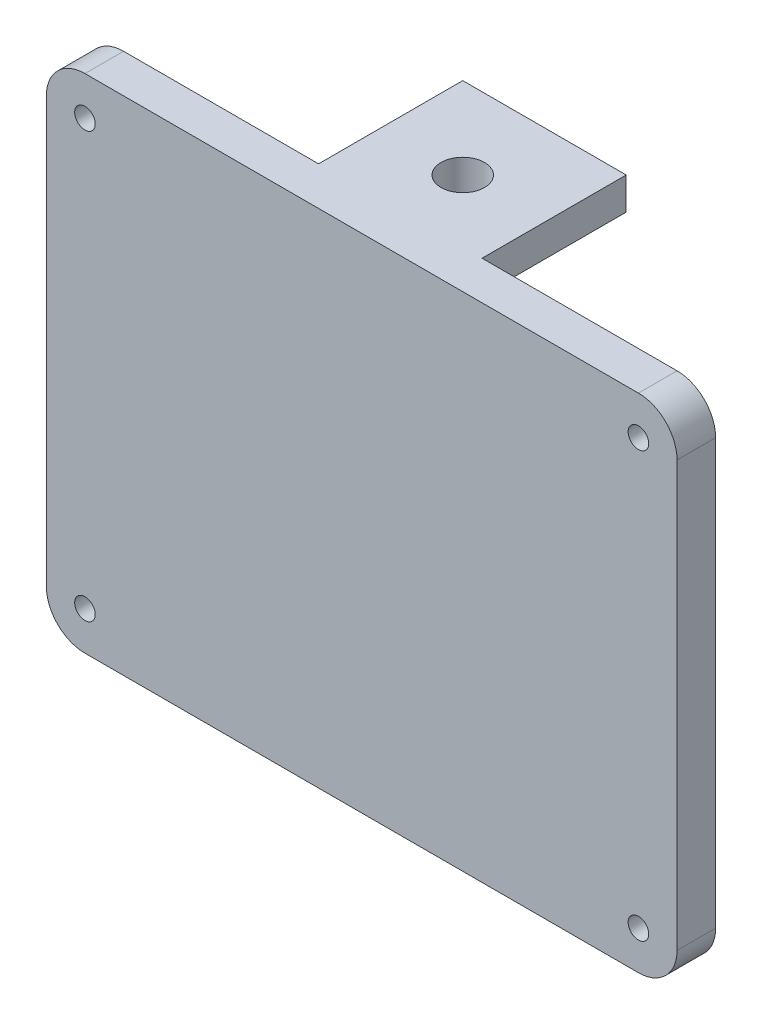
ISO-10303-21;
HEADER;
FILE_DESCRIPTION(('STEP AP214'),'2;1');
FILE_NAME('part.step','',(''),(''),'','','');
FILE_SCHEMA(('AUTOMOTIVE_DESIGN { 1 0 10303 214 1 1 1 1 }'));
ENDSEC;
DATA;
#1=APPLICATION_CONTEXT('core data for automotive mechanical design processes');
#2=APPLICATION_PROTOCOL_DEFINITION('international standard','automotive_design',2000,#1);
#3=PRODUCT_CONTEXT('',#1,'mechanical');
#4=PRODUCT('Part','Part','',(#3));
#5=PRODUCT_RELATED_PRODUCT_CATEGORY('part','',(#4));
#6=PRODUCT_DEFINITION_FORMATION('','',#4);
#7=PRODUCT_DEFINITION_CONTEXT('part definition',#1,'design');
#8=PRODUCT_DEFINITION('design','',#6,#7);
#9=PRODUCT_DEFINITION_SHAPE('','',#8);
#10=(LENGTH_UNIT() NAMED_UNIT(*) SI_UNIT(.MILLI.,.METRE.));
#11=(NAMED_UNIT(*) PLANE_ANGLE_UNIT() SI_UNIT($,.RADIAN.));
#12=(NAMED_UNIT(*) SI_UNIT($,.STERADIAN.) SOLID_ANGLE_UNIT());
#13=UNCERTAINTY_MEASURE_WITH_UNIT(LENGTH_MEASURE(1.E-05),#10,'distance_accuracy_value','');
#14=(GEOMETRIC_REPRESENTATION_CONTEXT(3) GLOBAL_UNCERTAINTY_ASSIGNED_CONTEXT((#13)) GLOBAL_UNIT_ASSIGNED_CONTEXT((#10,
#11,#12)) REPRESENTATION_CONTEXT('',''));
#15=CARTESIAN_POINT('',(0.,0.,0.));
#16=DIRECTION('',(0.,0.,1.));
#17=DIRECTION('',(1.,0.,0.));
#18=AXIS2_PLACEMENT_3D('',#15,#16,#17);
#19=CARTESIAN_POINT('',(12.7,5.,-12.7));
#20=DIRECTION('',(-1.,0.,0.));
#21=DIRECTION('',(0.,0.,1.));
#22=AXIS2_PLACEMENT_3D('',#19,#20,#21);
#23=PLANE('',#22);
#24=DIRECTION('',(0.,1.,0.));
#25=VECTOR('',#24,1.);
#26=CARTESIAN_POINT('',(12.7,5.,9.7));
#27=LINE('',#26,#25);
#28=CARTESIAN_POINT('',(12.7,0.,9.7));
#29=VERTEX_POINT('',#28);
#30=CARTESIAN_POINT('',(12.7,5.,9.7));
#31=VERTEX_POINT('',#30);
#32=EDGE_CURVE('E152',#29,#31,#27,.T.);
#33=ORIENTED_EDGE('',*,*,#32,.F.);
#34=DIRECTION('',(0.,0.,-1.));
#35=VECTOR('',#34,1.);
#36=CARTESIAN_POINT('',(12.7,0.,-12.7));
#37=LINE('',#36,#35);
#38=CARTESIAN_POINT('',(12.7,0.,-12.7));
#39=VERTEX_POINT('',#38);
#40=EDGE_CURVE('E137',#29,#39,#37,.T.);
#41=ORIENTED_EDGE('',*,*,#40,.T.);
#42=DIRECTION('',(0.,-1.,0.));
#43=VECTOR('',#42,1.);
#44=CARTESIAN_POINT('',(12.7,5.,-12.7));
#45=LINE('',#44,#43);
#46=CARTESIAN_POINT('',(12.7,5.,-12.7));
#47=VERTEX_POINT('',#46);
#48=EDGE_CURVE('E166',#47,#39,#45,.T.);
#49=ORIENTED_EDGE('',*,*,#48,.F.);
#50=DIRECTION('',(0.,0.,-1.));
#51=VECTOR('',#50,1.);
#52=CARTESIAN_POINT('',(12.7,5.,-12.7));
#53=LINE('',#52,#51);
#54=EDGE_CURVE('E153',#31,#47,#53,.T.);
#55=ORIENTED_EDGE('',*,*,#54,.F.);
#56=EDGE_LOOP('',(#33,#41,#49,#55));
#57=FACE_BOUND('',#56,.T.);
#58=ADVANCED_FACE('F47',(#57),#23,.F.);
#59=CARTESIAN_POINT('',(-12.7,5.,-12.7));
#60=DIRECTION('',(1.,0.,0.));
#61=DIRECTION('',(0.,0.,-1.));
#62=AXIS2_PLACEMENT_3D('',#59,#60,#61);
#63=PLANE('',#62);
#64=DIRECTION('',(0.,-1.,0.));
#65=VECTOR('',#64,1.);
#66=CARTESIAN_POINT('',(-12.7,5.,9.7));
#67=LINE('',#66,#65);
#68=CARTESIAN_POINT('',(-12.7,5.,9.7));
#69=VERTEX_POINT('',#68);
#70=CARTESIAN_POINT('',(-12.7,0.,9.7));
#71=VERTEX_POINT('',#70);
#72=EDGE_CURVE('E158',#69,#71,#67,.T.);
#73=ORIENTED_EDGE('',*,*,#72,.F.);
#74=DIRECTION('',(0.,0.,1.));
#75=VECTOR('',#74,1.);
#76=CARTESIAN_POINT('',(-12.7,5.,-12.7));
#77=LINE('',#76,#75);
#78=CARTESIAN_POINT('',(-12.7,5.,-12.7));
#79=VERTEX_POINT('',#78);
#80=EDGE_CURVE('E279',#79,#69,#77,.T.);
#81=ORIENTED_EDGE('',*,*,#80,.F.);
#82=DIRECTION('',(0.,-1.,0.));
#83=VECTOR('',#82,1.);
#84=CARTESIAN_POINT('',(-12.7,5.,-12.7));
#85=LINE('',#84,#83);
#86=CARTESIAN_POINT('',(-12.7,0.,-12.7));
#87=VERTEX_POINT('',#86);
#88=EDGE_CURVE('E172',#79,#87,#85,.T.);
#89=ORIENTED_EDGE('',*,*,#88,.T.);
#90=DIRECTION('',(0.,0.,1.));
#91=VECTOR('',#90,1.);
#92=CARTESIAN_POINT('',(-12.7,0.,-12.7));
#93=LINE('',#92,#91);
#94=EDGE_CURVE('E276',#87,#71,#93,.T.);
#95=ORIENTED_EDGE('',*,*,#94,.T.);
#96=EDGE_LOOP('',(#73,#81,#89,#95));
#97=FACE_BOUND('',#96,.T.);
#98=ADVANCED_FACE('F290',(#97),#63,.F.);
#99=CARTESIAN_POINT('',(0.,0.,0.));
#100=DIRECTION('',(0.,1.,0.));
#101=DIRECTION('',(0.,0.,1.));
#102=AXIS2_PLACEMENT_3D('',#99,#100,#101);
#103=PLANE('',#102);
#104=CARTESIAN_POINT('',(0.,0.,0.));
#105=DIRECTION('',(0.,1.,0.));
#106=DIRECTION('',(0.,0.,1.));
#107=AXIS2_PLACEMENT_3D('',#104,#105,#106);
#108=CIRCLE('',#107,3.37819999999999);
#109=CARTESIAN_POINT('',(0.,0.,3.37819999999999));
#110=VERTEX_POINT('',#109);
#111=EDGE_CURVE('E149',#110,#110,#108,.T.);
#112=ORIENTED_EDGE('',*,*,#111,.T.);
#113=EDGE_LOOP('',(#112));
#114=FACE_BOUND('',#113,.T.);
#115=DIRECTION('',(1.,0.,0.));
#116=VECTOR('',#115,1.);
#117=CARTESIAN_POINT('',(0.,0.,9.7));
#118=LINE('',#117,#116);
#119=EDGE_CURVE('E142',#71,#29,#118,.T.);
#120=ORIENTED_EDGE('',*,*,#119,.F.);
#121=ORIENTED_EDGE('',*,*,#94,.F.);
#122=DIRECTION('',(-1.,0.,0.));
#123=VECTOR('',#122,1.);
#124=CARTESIAN_POINT('',(-12.7,0.,-12.7));
#125=LINE('',#124,#123);
#126=EDGE_CURVE('E144',#39,#87,#125,.T.);
#127=ORIENTED_EDGE('',*,*,#126,.F.);
#128=ORIENTED_EDGE('',*,*,#40,.F.);
#129=EDGE_LOOP('',(#120,#121,#127,#128));
#130=FACE_BOUND('',#129,.T.);
#131=ADVANCED_FACE('F139',(#114,#130),#103,.F.);
#132=CARTESIAN_POINT('',(-12.7,5.,-12.7));
#133=DIRECTION('',(0.,0.,1.));
#134=DIRECTION('',(1.,0.,0.));
#135=AXIS2_PLACEMENT_3D('',#132,#133,#134);
#136=PLANE('',#135);
#137=ORIENTED_EDGE('',*,*,#126,.T.);
#138=ORIENTED_EDGE('',*,*,#88,.F.);
#139=DIRECTION('',(-1.,0.,0.));
#140=VECTOR('',#139,1.);
#141=CARTESIAN_POINT('',(-12.7,5.,-12.7));
#142=LINE('',#141,#140);
#143=EDGE_CURVE('E275',#47,#79,#142,.T.);
#144=ORIENTED_EDGE('',*,*,#143,.F.);
#145=ORIENTED_EDGE('',*,*,#48,.T.);
#146=EDGE_LOOP('',(#137,#138,#144,#145));
#147=FACE_BOUND('',#146,.T.);
#148=ADVANCED_FACE('F293',(#147),#136,.F.);
#149=CARTESIAN_POINT('',(0.,5.,0.));
#150=DIRECTION('',(0.,1.,0.));
#151=DIRECTION('',(0.,0.,1.));
#152=AXIS2_PLACEMENT_3D('',#149,#150,#151);
#153=PLANE('',#152);
#154=DIRECTION('',(1.,0.,0.));
#155=VECTOR('',#154,1.);
#156=CARTESIAN_POINT('',(0.,5.,15.7));
#157=LINE('',#156,#155);
#158=CARTESIAN_POINT('',(-43.,5.,15.7));
#159=VERTEX_POINT('',#158);
#160=CARTESIAN_POINT('',(43.,5.,15.7));
#161=VERTEX_POINT('',#160);
#162=EDGE_CURVE('E222',#159,#161,#157,.T.);
#163=ORIENTED_EDGE('',*,*,#162,.T.);
#164=DIRECTION('',(0.,0.,1.));
#165=VECTOR('',#164,1.);
#166=CARTESIAN_POINT('',(43.,5.,0.));
#167=LINE('',#166,#165);
#168=CARTESIAN_POINT('',(43.,5.,9.7));
#169=VERTEX_POINT('',#168);
#170=EDGE_CURVE('E11',#161,#169,#167,.F.);
#171=ORIENTED_EDGE('',*,*,#170,.T.);
#172=DIRECTION('',(1.,0.,0.));
#173=VECTOR('',#172,1.);
#174=CARTESIAN_POINT('',(0.,5.,9.7));
#175=LINE('',#174,#173);
#176=EDGE_CURVE('E264',#31,#169,#175,.T.);
#177=ORIENTED_EDGE('',*,*,#176,.F.);
#178=ORIENTED_EDGE('',*,*,#54,.T.);
#179=ORIENTED_EDGE('',*,*,#143,.T.);
#180=ORIENTED_EDGE('',*,*,#80,.T.);
#181=CARTESIAN_POINT('',(-43.,5.,9.7));
#182=VERTEX_POINT('',#181);
#183=EDGE_CURVE('E225',#182,#69,#175,.T.);
#184=ORIENTED_EDGE('',*,*,#183,.F.);
#185=DIRECTION('',(0.,0.,1.));
#186=VECTOR('',#185,1.);
#187=CARTESIAN_POINT('',(-43.,5.,15.7));
#188=LINE('',#187,#186);
#189=EDGE_CURVE('E56',#182,#159,#188,.T.);
#190=ORIENTED_EDGE('',*,*,#189,.T.);
#191=EDGE_LOOP('',(#163,#171,#177,#178,#179,#180,#184,#190));
#192=FACE_BOUND('',#191,.T.);
#193=CARTESIAN_POINT('',(0.,5.,0.));
#194=DIRECTION('',(0.,1.,0.));
#195=DIRECTION('',(0.,0.,1.));
#196=AXIS2_PLACEMENT_3D('',#193,#194,#195);
#197=CIRCLE('',#196,3.37819999999999);
#198=CARTESIAN_POINT('',(0.,5.,3.37819999999999));
#199=VERTEX_POINT('',#198);
#200=EDGE_CURVE('E157',#199,#199,#197,.T.);
#201=ORIENTED_EDGE('',*,*,#200,.F.);
#202=EDGE_LOOP('',(#201));
#203=FACE_BOUND('',#202,.T.);
#204=ADVANCED_FACE('F220',(#192,#203),#153,.T.);
#205=CARTESIAN_POINT('',(0.,5.,0.));
#206=DIRECTION('',(0.,1.,0.));
#207=DIRECTION('',(0.,0.,1.));
#208=AXIS2_PLACEMENT_3D('',#205,#206,#207);
#209=CYLINDRICAL_SURFACE('',#208,3.37819999999999);
#210=ORIENTED_EDGE('',*,*,#111,.F.);
#211=EDGE_LOOP('',(#210));
#212=FACE_BOUND('',#211,.T.);
#213=ORIENTED_EDGE('',*,*,#200,.T.);
#214=EDGE_LOOP('',(#213));
#215=FACE_BOUND('',#214,.T.);
#216=ADVANCED_FACE('F388',(#212,#215),#209,.F.);
#217=CARTESIAN_POINT('',(0.,0.,9.7));
#218=DIRECTION('',(0.,0.,1.));
#219=DIRECTION('',(1.,0.,0.));
#220=AXIS2_PLACEMENT_3D('',#217,#218,#219);
#221=PLANE('',#220);
#222=CARTESIAN_POINT('',(-43.,-67.,9.7));
#223=DIRECTION('',(0.,0.,1.));
#224=DIRECTION('',(1.,0.,0.));
#225=AXIS2_PLACEMENT_3D('',#222,#223,#224);
#226=CIRCLE('',#225,1.6);
#227=CARTESIAN_POINT('',(-41.4,-67.,9.7));
#228=VERTEX_POINT('',#227);
#229=EDGE_CURVE('E310',#228,#228,#226,.T.);
#230=ORIENTED_EDGE('',*,*,#229,.T.);
#231=EDGE_LOOP('',(#230));
#232=FACE_BOUND('',#231,.T.);
#233=CARTESIAN_POINT('',(43.,-67.,9.7));
#234=DIRECTION('',(0.,0.,1.));
#235=DIRECTION('',(1.,0.,0.));
#236=AXIS2_PLACEMENT_3D('',#233,#234,#235);
#237=CIRCLE('',#236,1.6);
#238=CARTESIAN_POINT('',(44.6,-67.,9.7));
#239=VERTEX_POINT('',#238);
#240=EDGE_CURVE('E314',#239,#239,#237,.T.);
#241=ORIENTED_EDGE('',*,*,#240,.T.);
#242=EDGE_LOOP('',(#241));
#243=FACE_BOUND('',#242,.T.);
#244=CARTESIAN_POINT('',(43.,-1.,9.7));
#245=DIRECTION('',(0.,0.,1.));
#246=DIRECTION('',(1.,0.,0.));
#247=AXIS2_PLACEMENT_3D('',#244,#245,#246);
#248=CIRCLE('',#247,1.6);
#249=CARTESIAN_POINT('',(44.6,-1.,9.7));
#250=VERTEX_POINT('',#249);
#251=EDGE_CURVE('E317',#250,#250,#248,.T.);
#252=ORIENTED_EDGE('',*,*,#251,.T.);
#253=EDGE_LOOP('',(#252));
#254=FACE_BOUND('',#253,.T.);
#255=CARTESIAN_POINT('',(-43.,-1.,9.7));
#256=DIRECTION('',(0.,0.,1.));
#257=DIRECTION('',(1.,0.,0.));
#258=AXIS2_PLACEMENT_3D('',#255,#256,#257);
#259=CIRCLE('',#258,1.6);
#260=CARTESIAN_POINT('',(-41.4,-1.,9.7));
#261=VERTEX_POINT('',#260);
#262=EDGE_CURVE('E240',#261,#261,#259,.T.);
#263=ORIENTED_EDGE('',*,*,#262,.T.);
#264=EDGE_LOOP('',(#263));
#265=FACE_BOUND('',#264,.T.);
#266=DIRECTION('',(0.,1.,0.));
#267=VECTOR('',#266,1.);
#268=CARTESIAN_POINT('',(49.,0.,9.7));
#269=LINE('',#268,#267);
#270=CARTESIAN_POINT('',(49.,-67.,9.7));
#271=VERTEX_POINT('',#270);
#272=CARTESIAN_POINT('',(49.,-1.,9.7));
#273=VERTEX_POINT('',#272);
#274=EDGE_CURVE('E306',#271,#273,#269,.T.);
#275=ORIENTED_EDGE('',*,*,#274,.F.);
#276=CARTESIAN_POINT('',(43.,-67.,9.7));
#277=DIRECTION('',(0.,0.,1.));
#278=DIRECTION('',(1.,0.,0.));
#279=AXIS2_PLACEMENT_3D('',#276,#277,#278);
#280=CIRCLE('',#279,6.);
#281=CARTESIAN_POINT('',(43.,-73.,9.7));
#282=VERTEX_POINT('',#281);
#283=EDGE_CURVE('E206',#271,#282,#280,.F.);
#284=ORIENTED_EDGE('',*,*,#283,.T.);
#285=DIRECTION('',(1.,0.,0.));
#286=VECTOR('',#285,1.);
#287=CARTESIAN_POINT('',(0.,-73.,9.7));
#288=LINE('',#287,#286);
#289=CARTESIAN_POINT('',(-43.,-73.,9.7));
#290=VERTEX_POINT('',#289);
#291=EDGE_CURVE('E302',#290,#282,#288,.T.);
#292=ORIENTED_EDGE('',*,*,#291,.F.);
#293=CARTESIAN_POINT('',(-43.,-67.,9.7));
#294=DIRECTION('',(0.,0.,1.));
#295=DIRECTION('',(1.,0.,0.));
#296=AXIS2_PLACEMENT_3D('',#293,#294,#295);
#297=CIRCLE('',#296,6.);
#298=CARTESIAN_POINT('',(-49.,-67.,9.7));
#299=VERTEX_POINT('',#298);
#300=EDGE_CURVE('E203',#290,#299,#297,.F.);
#301=ORIENTED_EDGE('',*,*,#300,.T.);
#302=DIRECTION('',(0.,1.,0.));
#303=VECTOR('',#302,1.);
#304=CARTESIAN_POINT('',(-49.,0.,9.7));
#305=LINE('',#304,#303);
#306=CARTESIAN_POINT('',(-49.,-1.,9.7));
#307=VERTEX_POINT('',#306);
#308=EDGE_CURVE('E298',#299,#307,#305,.T.);
#309=ORIENTED_EDGE('',*,*,#308,.T.);
#310=CARTESIAN_POINT('',(-43.,-1.,9.7));
#311=DIRECTION('',(0.,0.,1.));
#312=DIRECTION('',(1.,0.,0.));
#313=AXIS2_PLACEMENT_3D('',#310,#311,#312);
#314=CIRCLE('',#313,6.);
#315=EDGE_CURVE('E63',#307,#182,#314,.F.);
#316=ORIENTED_EDGE('',*,*,#315,.T.);
#317=ORIENTED_EDGE('',*,*,#183,.T.);
#318=ORIENTED_EDGE('',*,*,#72,.T.);
#319=ORIENTED_EDGE('',*,*,#119,.T.);
#320=ORIENTED_EDGE('',*,*,#32,.T.);
#321=ORIENTED_EDGE('',*,*,#176,.T.);
#322=CARTESIAN_POINT('',(43.,-1.,9.7));
#323=DIRECTION('',(0.,0.,1.));
#324=DIRECTION('',(1.,0.,0.));
#325=AXIS2_PLACEMENT_3D('',#322,#323,#324);
#326=CIRCLE('',#325,6.);
#327=EDGE_CURVE('E200',#169,#273,#326,.F.);
#328=ORIENTED_EDGE('',*,*,#327,.T.);
#329=EDGE_LOOP('',(#275,#284,#292,#301,#309,#316,#317,#318,#319,#320,#321,#328));
#330=FACE_BOUND('',#329,.T.);
#331=ADVANCED_FACE('F162',(#232,#243,#254,#265,#330),#221,.F.);
#332=CARTESIAN_POINT('',(49.,0.,9.7));
#333=DIRECTION('',(1.,0.,0.));
#334=DIRECTION('',(0.,0.,-1.));
#335=AXIS2_PLACEMENT_3D('',#332,#333,#334);
#336=PLANE('',#335);
#337=DIRECTION('',(0.,1.,0.));
#338=VECTOR('',#337,1.);
#339=CARTESIAN_POINT('',(49.,0.,15.7));
#340=LINE('',#339,#338);
#341=CARTESIAN_POINT('',(49.,-67.,15.7));
#342=VERTEX_POINT('',#341);
#343=CARTESIAN_POINT('',(49.,-1.,15.7));
#344=VERTEX_POINT('',#343);
#345=EDGE_CURVE('E245',#342,#344,#340,.T.);
#346=ORIENTED_EDGE('',*,*,#345,.F.);
#347=DIRECTION('',(0.,0.,1.));
#348=VECTOR('',#347,1.);
#349=CARTESIAN_POINT('',(49.,-67.,9.7));
#350=LINE('',#349,#348);
#351=EDGE_CURVE('E195',#342,#271,#350,.F.);
#352=ORIENTED_EDGE('',*,*,#351,.T.);
#353=ORIENTED_EDGE('',*,*,#274,.T.);
#354=DIRECTION('',(0.,0.,1.));
#355=VECTOR('',#354,1.);
#356=CARTESIAN_POINT('',(49.,-1.,9.7));
#357=LINE('',#356,#355);
#358=EDGE_CURVE('E191',#273,#344,#357,.T.);
#359=ORIENTED_EDGE('',*,*,#358,.T.);
#360=EDGE_LOOP('',(#346,#352,#353,#359));
#361=FACE_BOUND('',#360,.T.);
#362=ADVANCED_FACE('F366',(#361),#336,.T.);
#363=CARTESIAN_POINT('',(0.,-73.,9.7));
#364=DIRECTION('',(0.,-1.,0.));
#365=DIRECTION('',(0.,0.,-1.));
#366=AXIS2_PLACEMENT_3D('',#363,#364,#365);
#367=PLANE('',#366);
#368=ORIENTED_EDGE('',*,*,#291,.T.);
#369=DIRECTION('',(0.,0.,1.));
#370=VECTOR('',#369,1.);
#371=CARTESIAN_POINT('',(43.,-73.,9.7));
#372=LINE('',#371,#370);
#373=CARTESIAN_POINT('',(43.,-73.,15.7));
#374=VERTEX_POINT('',#373);
#375=EDGE_CURVE('E170',#282,#374,#372,.T.);
#376=ORIENTED_EDGE('',*,*,#375,.T.);
#377=DIRECTION('',(1.,0.,0.));
#378=VECTOR('',#377,1.);
#379=CARTESIAN_POINT('',(0.,-73.,15.7));
#380=LINE('',#379,#378);
#381=CARTESIAN_POINT('',(-43.,-73.,15.7));
#382=VERTEX_POINT('',#381);
#383=EDGE_CURVE('E237',#382,#374,#380,.T.);
#384=ORIENTED_EDGE('',*,*,#383,.F.);
#385=DIRECTION('',(0.,0.,1.));
#386=VECTOR('',#385,1.);
#387=CARTESIAN_POINT('',(-43.,-73.,9.7));
#388=LINE('',#387,#386);
#389=EDGE_CURVE('E165',#382,#290,#388,.F.);
#390=ORIENTED_EDGE('',*,*,#389,.T.);
#391=EDGE_LOOP('',(#368,#376,#384,#390));
#392=FACE_BOUND('',#391,.T.);
#393=ADVANCED_FACE('F372',(#392),#367,.T.);
#394=CARTESIAN_POINT('',(43.,-1.,9.7));
#395=DIRECTION('',(0.,0.,1.));
#396=DIRECTION('',(1.,0.,0.));
#397=AXIS2_PLACEMENT_3D('',#394,#395,#396);
#398=CYLINDRICAL_SURFACE('',#397,1.6);
#399=ORIENTED_EDGE('',*,*,#251,.F.);
#400=EDGE_LOOP('',(#399));
#401=FACE_BOUND('',#400,.T.);
#402=CARTESIAN_POINT('',(43.,-1.,15.7));
#403=DIRECTION('',(0.,0.,1.));
#404=DIRECTION('',(1.,0.,0.));
#405=AXIS2_PLACEMENT_3D('',#402,#403,#404);
#406=CIRCLE('',#405,1.6);
#407=CARTESIAN_POINT('',(44.6,-1.,15.7));
#408=VERTEX_POINT('',#407);
#409=EDGE_CURVE('E256',#408,#408,#406,.T.);
#410=ORIENTED_EDGE('',*,*,#409,.T.);
#411=EDGE_LOOP('',(#410));
#412=FACE_BOUND('',#411,.T.);
#413=ADVANCED_FACE('F460',(#401,#412),#398,.F.);
#414=CARTESIAN_POINT('',(43.,-67.,9.7));
#415=DIRECTION('',(0.,0.,1.));
#416=DIRECTION('',(1.,0.,0.));
#417=AXIS2_PLACEMENT_3D('',#414,#415,#416);
#418=CYLINDRICAL_SURFACE('',#417,1.6);
#419=ORIENTED_EDGE('',*,*,#240,.F.);
#420=EDGE_LOOP('',(#419));
#421=FACE_BOUND('',#420,.T.);
#422=CARTESIAN_POINT('',(43.,-67.,15.7));
#423=DIRECTION('',(0.,0.,1.));
#424=DIRECTION('',(1.,0.,0.));
#425=AXIS2_PLACEMENT_3D('',#422,#423,#424);
#426=CIRCLE('',#425,1.6);
#427=CARTESIAN_POINT('',(44.6,-67.,15.7));
#428=VERTEX_POINT('',#427);
#429=EDGE_CURVE('E252',#428,#428,#426,.T.);
#430=ORIENTED_EDGE('',*,*,#429,.T.);
#431=EDGE_LOOP('',(#430));
#432=FACE_BOUND('',#431,.T.);
#433=ADVANCED_FACE('F382',(#421,#432),#418,.F.);
#434=CARTESIAN_POINT('',(-43.,-67.,9.7));
#435=DIRECTION('',(0.,0.,1.));
#436=DIRECTION('',(1.,0.,0.));
#437=AXIS2_PLACEMENT_3D('',#434,#435,#436);
#438=CYLINDRICAL_SURFACE('',#437,1.6);
#439=ORIENTED_EDGE('',*,*,#229,.F.);
#440=EDGE_LOOP('',(#439));
#441=FACE_BOUND('',#440,.T.);
#442=CARTESIAN_POINT('',(-43.,-67.,15.7));
#443=DIRECTION('',(0.,0.,1.));
#444=DIRECTION('',(1.,0.,0.));
#445=AXIS2_PLACEMENT_3D('',#442,#443,#444);
#446=CIRCLE('',#445,1.6);
#447=CARTESIAN_POINT('',(-41.4,-67.,15.7));
#448=VERTEX_POINT('',#447);
#449=EDGE_CURVE('E248',#448,#448,#446,.T.);
#450=ORIENTED_EDGE('',*,*,#449,.T.);
#451=EDGE_LOOP('',(#450));
#452=FACE_BOUND('',#451,.T.);
#453=ADVANCED_FACE('F376',(#441,#452),#438,.F.);
#454=CARTESIAN_POINT('',(-49.,0.,9.7));
#455=DIRECTION('',(1.,0.,0.));
#456=DIRECTION('',(0.,0.,-1.));
#457=AXIS2_PLACEMENT_3D('',#454,#455,#456);
#458=PLANE('',#457);
#459=ORIENTED_EDGE('',*,*,#308,.F.);
#460=DIRECTION('',(0.,0.,1.));
#461=VECTOR('',#460,1.);
#462=CARTESIAN_POINT('',(-49.,-67.,15.7));
#463=LINE('',#462,#461);
#464=CARTESIAN_POINT('',(-49.,-67.,15.7));
#465=VERTEX_POINT('',#464);
#466=EDGE_CURVE('E211',#299,#465,#463,.T.);
#467=ORIENTED_EDGE('',*,*,#466,.T.);
#468=DIRECTION('',(0.,1.,0.));
#469=VECTOR('',#468,1.);
#470=CARTESIAN_POINT('',(-49.,0.,15.7));
#471=LINE('',#470,#469);
#472=CARTESIAN_POINT('',(-49.,-1.,15.7));
#473=VERTEX_POINT('',#472);
#474=EDGE_CURVE('E234',#465,#473,#471,.T.);
#475=ORIENTED_EDGE('',*,*,#474,.T.);
#476=DIRECTION('',(0.,0.,1.));
#477=VECTOR('',#476,1.);
#478=CARTESIAN_POINT('',(-49.,-1.,9.7));
#479=LINE('',#478,#477);
#480=EDGE_CURVE('E71',#473,#307,#479,.F.);
#481=ORIENTED_EDGE('',*,*,#480,.T.);
#482=EDGE_LOOP('',(#459,#467,#475,#481));
#483=FACE_BOUND('',#482,.T.);
#484=ADVANCED_FACE('F330',(#483),#458,.F.);
#485=CARTESIAN_POINT('',(-43.,-1.,9.7));
#486=DIRECTION('',(0.,0.,1.));
#487=DIRECTION('',(1.,0.,0.));
#488=AXIS2_PLACEMENT_3D('',#485,#486,#487);
#489=CYLINDRICAL_SURFACE('',#488,1.6);
#490=ORIENTED_EDGE('',*,*,#262,.F.);
#491=EDGE_LOOP('',(#490));
#492=FACE_BOUND('',#491,.T.);
#493=CARTESIAN_POINT('',(-43.,-1.,15.7));
#494=DIRECTION('',(0.,0.,1.));
#495=DIRECTION('',(1.,0.,0.));
#496=AXIS2_PLACEMENT_3D('',#493,#494,#495);
#497=CIRCLE('',#496,1.6);
#498=CARTESIAN_POINT('',(-41.4,-1.,15.7));
#499=VERTEX_POINT('',#498);
#500=EDGE_CURVE('E260',#499,#499,#497,.T.);
#501=ORIENTED_EDGE('',*,*,#500,.T.);
#502=EDGE_LOOP('',(#501));
#503=FACE_BOUND('',#502,.T.);
#504=ADVANCED_FACE('F327',(#492,#503),#489,.F.);
#505=CARTESIAN_POINT('',(0.,0.,15.7));
#506=DIRECTION('',(0.,0.,1.));
#507=DIRECTION('',(1.,0.,0.));
#508=AXIS2_PLACEMENT_3D('',#505,#506,#507);
#509=PLANE('',#508);
#510=ORIENTED_EDGE('',*,*,#383,.T.);
#511=CARTESIAN_POINT('',(43.,-67.,15.7));
#512=DIRECTION('',(0.,0.,1.));
#513=DIRECTION('',(1.,0.,0.));
#514=AXIS2_PLACEMENT_3D('',#511,#512,#513);
#515=CIRCLE('',#514,6.);
#516=EDGE_CURVE('E188',#374,#342,#515,.T.);
#517=ORIENTED_EDGE('',*,*,#516,.T.);
#518=ORIENTED_EDGE('',*,*,#345,.T.);
#519=CARTESIAN_POINT('',(43.,-1.,15.7));
#520=DIRECTION('',(0.,0.,1.));
#521=DIRECTION('',(1.,0.,0.));
#522=AXIS2_PLACEMENT_3D('',#519,#520,#521);
#523=CIRCLE('',#522,6.);
#524=EDGE_CURVE('E182',#344,#161,#523,.T.);
#525=ORIENTED_EDGE('',*,*,#524,.T.);
#526=ORIENTED_EDGE('',*,*,#162,.F.);
#527=CARTESIAN_POINT('',(-43.,-1.,15.7));
#528=DIRECTION('',(0.,0.,1.));
#529=DIRECTION('',(1.,0.,0.));
#530=AXIS2_PLACEMENT_3D('',#527,#528,#529);
#531=CIRCLE('',#530,6.);
#532=EDGE_CURVE('E179',#159,#473,#531,.T.);
#533=ORIENTED_EDGE('',*,*,#532,.T.);
#534=ORIENTED_EDGE('',*,*,#474,.F.);
#535=CARTESIAN_POINT('',(-43.,-67.,15.7));
#536=DIRECTION('',(0.,0.,1.));
#537=DIRECTION('',(1.,0.,0.));
#538=AXIS2_PLACEMENT_3D('',#535,#536,#537);
#539=CIRCLE('',#538,6.);
#540=EDGE_CURVE('E185',#465,#382,#539,.T.);
#541=ORIENTED_EDGE('',*,*,#540,.T.);
#542=EDGE_LOOP('',(#510,#517,#518,#525,#526,#533,#534,#541));
#543=FACE_BOUND('',#542,.T.);
#544=ORIENTED_EDGE('',*,*,#449,.F.);
#545=EDGE_LOOP('',(#544));
#546=FACE_BOUND('',#545,.T.);
#547=ORIENTED_EDGE('',*,*,#429,.F.);
#548=EDGE_LOOP('',(#547));
#549=FACE_BOUND('',#548,.T.);
#550=ORIENTED_EDGE('',*,*,#409,.F.);
#551=EDGE_LOOP('',(#550));
#552=FACE_BOUND('',#551,.T.);
#553=ORIENTED_EDGE('',*,*,#500,.F.);
#554=EDGE_LOOP('',(#553));
#555=FACE_BOUND('',#554,.T.);
#556=ADVANCED_FACE('F229',(#543,#546,#549,#552,#555),#509,.T.);
#557=CARTESIAN_POINT('',(43.,-67.,9.7));
#558=DIRECTION('',(0.,0.,1.));
#559=DIRECTION('',(1.,0.,0.));
#560=AXIS2_PLACEMENT_3D('',#557,#558,#559);
#561=CYLINDRICAL_SURFACE('',#560,6.);
#562=ORIENTED_EDGE('',*,*,#283,.F.);
#563=ORIENTED_EDGE('',*,*,#351,.F.);
#564=ORIENTED_EDGE('',*,*,#516,.F.);
#565=ORIENTED_EDGE('',*,*,#375,.F.);
#566=EDGE_LOOP('',(#562,#563,#564,#565));
#567=FACE_BOUND('',#566,.T.);
#568=ADVANCED_FACE('F335',(#567),#561,.T.);
#569=CARTESIAN_POINT('',(-43.,-67.,9.7));
#570=DIRECTION('',(0.,0.,-1.));
#571=DIRECTION('',(-1.,0.,0.));
#572=AXIS2_PLACEMENT_3D('',#569,#570,#571);
#573=CYLINDRICAL_SURFACE('',#572,6.);
#574=ORIENTED_EDGE('',*,*,#300,.F.);
#575=ORIENTED_EDGE('',*,*,#389,.F.);
#576=ORIENTED_EDGE('',*,*,#540,.F.);
#577=ORIENTED_EDGE('',*,*,#466,.F.);
#578=EDGE_LOOP('',(#574,#575,#576,#577));
#579=FACE_BOUND('',#578,.T.);
#580=ADVANCED_FACE('F341',(#579),#573,.T.);
#581=CARTESIAN_POINT('',(43.,-1.,9.7));
#582=DIRECTION('',(0.,0.,1.));
#583=DIRECTION('',(1.,0.,0.));
#584=AXIS2_PLACEMENT_3D('',#581,#582,#583);
#585=CYLINDRICAL_SURFACE('',#584,6.);
#586=ORIENTED_EDGE('',*,*,#327,.F.);
#587=ORIENTED_EDGE('',*,*,#170,.F.);
#588=ORIENTED_EDGE('',*,*,#524,.F.);
#589=ORIENTED_EDGE('',*,*,#358,.F.);
#590=EDGE_LOOP('',(#586,#587,#588,#589));
#591=FACE_BOUND('',#590,.T.);
#592=ADVANCED_FACE('F355',(#591),#585,.T.);
#593=CARTESIAN_POINT('',(-43.,-1.,0.));
#594=DIRECTION('',(0.,0.,-1.));
#595=DIRECTION('',(-1.,0.,0.));
#596=AXIS2_PLACEMENT_3D('',#593,#594,#595);
#597=CYLINDRICAL_SURFACE('',#596,6.);
#598=ORIENTED_EDGE('',*,*,#315,.F.);
#599=ORIENTED_EDGE('',*,*,#480,.F.);
#600=ORIENTED_EDGE('',*,*,#532,.F.);
#601=ORIENTED_EDGE('',*,*,#189,.F.);
#602=EDGE_LOOP('',(#598,#599,#600,#601));
#603=FACE_BOUND('',#602,.T.);
#604=ADVANCED_FACE('F49',(#603),#597,.T.);
#605=CLOSED_SHELL('',(#58,#98,#131,#148,#204,#216,#331,#362,#393,#413,#433,#453,#484,#504,#556,
#568,#580,#592,#604));
#606=MANIFOLD_SOLID_BREP('B2',#605);
#607=ADVANCED_BREP_SHAPE_REPRESENTATION('',(#18,#606),#14);
#608=SHAPE_DEFINITION_REPRESENTATION(#9,#607);
ENDSEC;
END-ISO-10303-21;
